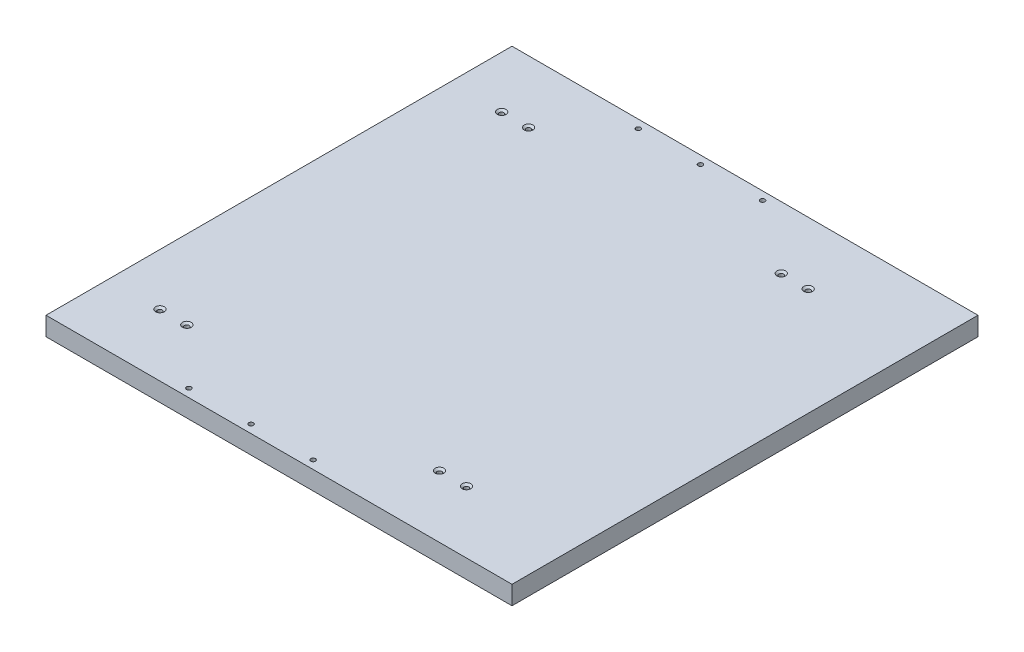
ISO-10303-21;
HEADER;
FILE_DESCRIPTION(('STEP AP214'),'2;1');
FILE_NAME('part.step','',(''),(''),'','','');
FILE_SCHEMA(('AUTOMOTIVE_DESIGN { 1 0 10303 214 1 1 1 1 }'));
ENDSEC;
DATA;
#1=APPLICATION_CONTEXT('core data for automotive mechanical design processes');
#2=APPLICATION_PROTOCOL_DEFINITION('international standard','automotive_design',2000,#1);
#3=PRODUCT_CONTEXT('',#1,'mechanical');
#4=PRODUCT('Part','Part','',(#3));
#5=PRODUCT_RELATED_PRODUCT_CATEGORY('part','',(#4));
#6=PRODUCT_DEFINITION_FORMATION('','',#4);
#7=PRODUCT_DEFINITION_CONTEXT('part definition',#1,'design');
#8=PRODUCT_DEFINITION('design','',#6,#7);
#9=PRODUCT_DEFINITION_SHAPE('','',#8);
#10=(LENGTH_UNIT() NAMED_UNIT(*) SI_UNIT(.MILLI.,.METRE.));
#11=(NAMED_UNIT(*) PLANE_ANGLE_UNIT() SI_UNIT($,.RADIAN.));
#12=(NAMED_UNIT(*) SI_UNIT($,.STERADIAN.) SOLID_ANGLE_UNIT());
#13=UNCERTAINTY_MEASURE_WITH_UNIT(LENGTH_MEASURE(1.E-05),#10,'distance_accuracy_value','');
#14=(GEOMETRIC_REPRESENTATION_CONTEXT(3) GLOBAL_UNCERTAINTY_ASSIGNED_CONTEXT((#13)) GLOBAL_UNIT_ASSIGNED_CONTEXT((#10,
#11,#12)) REPRESENTATION_CONTEXT('',''));
#15=CARTESIAN_POINT('',(0.,0.,0.));
#16=DIRECTION('',(0.,0.,1.));
#17=DIRECTION('',(1.,0.,0.));
#18=AXIS2_PLACEMENT_3D('',#15,#16,#17);
#19=CARTESIAN_POINT('',(0.,-9.,0.));
#20=DIRECTION('',(0.,-1.,0.));
#21=DIRECTION('',(0.,0.,-1.));
#22=AXIS2_PLACEMENT_3D('',#19,#20,#21);
#23=PLANE('',#22);
#24=CARTESIAN_POINT('',(-149.,-9.,165.));
#25=DIRECTION('',(0.,1.,0.));
#26=DIRECTION('',(0.,0.,1.));
#27=AXIS2_PLACEMENT_3D('',#24,#25,#26);
#28=CIRCLE('',#27,2.2479);
#29=CARTESIAN_POINT('',(-149.,-9.,167.2479));
#30=VERTEX_POINT('',#29);
#31=EDGE_CURVE('E331',#30,#30,#28,.T.);
#32=ORIENTED_EDGE('',*,*,#31,.T.);
#33=EDGE_LOOP('',(#32));
#34=FACE_BOUND('',#33,.T.);
#35=CARTESIAN_POINT('',(-35.0000000000001,-9.,-217.));
#36=DIRECTION('',(0.,-1.,0.));
#37=DIRECTION('',(0.,0.,-1.));
#38=AXIS2_PLACEMENT_3D('',#35,#36,#37);
#39=CIRCLE('',#38,4.2164);
#40=CARTESIAN_POINT('',(-35.0000000000001,-9.,-221.2164));
#41=VERTEX_POINT('',#40);
#42=EDGE_CURVE('E333',#41,#41,#39,.T.);
#43=ORIENTED_EDGE('',*,*,#42,.F.);
#44=EDGE_LOOP('',(#43));
#45=FACE_BOUND('',#44,.T.);
#46=CARTESIAN_POINT('',(-94.9999999999999,-9.,-217.));
#47=DIRECTION('',(0.,-1.,0.));
#48=DIRECTION('',(0.,0.,-1.));
#49=AXIS2_PLACEMENT_3D('',#46,#47,#48);
#50=CIRCLE('',#49,4.21639999999999);
#51=CARTESIAN_POINT('',(-94.9999999999999,-9.,-221.2164));
#52=VERTEX_POINT('',#51);
#53=EDGE_CURVE('E342',#52,#52,#50,.T.);
#54=ORIENTED_EDGE('',*,*,#53,.F.);
#55=EDGE_LOOP('',(#54));
#56=FACE_BOUND('',#55,.T.);
#57=CARTESIAN_POINT('',(24.9999999999999,-9.,-217.));
#58=DIRECTION('',(0.,-1.,0.));
#59=DIRECTION('',(0.,0.,-1.));
#60=AXIS2_PLACEMENT_3D('',#57,#58,#59);
#61=CIRCLE('',#60,4.2164);
#62=CARTESIAN_POINT('',(24.9999999999999,-9.,-221.2164));
#63=VERTEX_POINT('',#62);
#64=EDGE_CURVE('E351',#63,#63,#61,.T.);
#65=ORIENTED_EDGE('',*,*,#64,.F.);
#66=EDGE_LOOP('',(#65));
#67=FACE_BOUND('',#66,.T.);
#68=CARTESIAN_POINT('',(-35.0000000000001,-9.,217.));
#69=DIRECTION('',(0.,-1.,0.));
#70=DIRECTION('',(0.,0.,-1.));
#71=AXIS2_PLACEMENT_3D('',#68,#69,#70);
#72=CIRCLE('',#71,4.2164);
#73=CARTESIAN_POINT('',(-35.0000000000001,-9.,212.7836));
#74=VERTEX_POINT('',#73);
#75=EDGE_CURVE('E360',#74,#74,#72,.T.);
#76=ORIENTED_EDGE('',*,*,#75,.F.);
#77=EDGE_LOOP('',(#76));
#78=FACE_BOUND('',#77,.T.);
#79=CARTESIAN_POINT('',(-94.9999999999999,-9.,217.));
#80=DIRECTION('',(0.,-1.,0.));
#81=DIRECTION('',(0.,0.,-1.));
#82=AXIS2_PLACEMENT_3D('',#79,#80,#81);
#83=CIRCLE('',#82,4.21639999999999);
#84=CARTESIAN_POINT('',(-94.9999999999999,-9.,212.7836));
#85=VERTEX_POINT('',#84);
#86=EDGE_CURVE('E369',#85,#85,#83,.T.);
#87=ORIENTED_EDGE('',*,*,#86,.F.);
#88=EDGE_LOOP('',(#87));
#89=FACE_BOUND('',#88,.T.);
#90=CARTESIAN_POINT('',(24.9999999999999,-9.,217.));
#91=DIRECTION('',(0.,-1.,0.));
#92=DIRECTION('',(0.,0.,-1.));
#93=AXIS2_PLACEMENT_3D('',#90,#91,#92);
#94=CIRCLE('',#93,4.2164);
#95=CARTESIAN_POINT('',(24.9999999999999,-9.,212.7836));
#96=VERTEX_POINT('',#95);
#97=EDGE_CURVE('E378',#96,#96,#94,.T.);
#98=ORIENTED_EDGE('',*,*,#97,.F.);
#99=EDGE_LOOP('',(#98));
#100=FACE_BOUND('',#99,.T.);
#101=DIRECTION('',(1.,0.,0.));
#102=VECTOR('',#101,1.);
#103=CARTESIAN_POINT('',(-225.,-9.,-225.));
#104=LINE('',#103,#102);
#105=CARTESIAN_POINT('',(-225.,-9.,-225.));
#106=VERTEX_POINT('',#105);
#107=CARTESIAN_POINT('',(225.,-9.,-225.));
#108=VERTEX_POINT('',#107);
#109=EDGE_CURVE('E109',#106,#108,#104,.T.);
#110=ORIENTED_EDGE('',*,*,#109,.T.);
#111=DIRECTION('',(0.,0.,1.));
#112=VECTOR('',#111,1.);
#113=CARTESIAN_POINT('',(225.,-9.,-225.));
#114=LINE('',#113,#112);
#115=CARTESIAN_POINT('',(225.,-9.,225.));
#116=VERTEX_POINT('',#115);
#117=EDGE_CURVE('E112',#108,#116,#114,.T.);
#118=ORIENTED_EDGE('',*,*,#117,.T.);
#119=DIRECTION('',(1.,0.,0.));
#120=VECTOR('',#119,1.);
#121=CARTESIAN_POINT('',(-225.,-9.,225.));
#122=LINE('',#121,#120);
#123=CARTESIAN_POINT('',(-225.,-9.,225.));
#124=VERTEX_POINT('',#123);
#125=EDGE_CURVE('E100',#124,#116,#122,.T.);
#126=ORIENTED_EDGE('',*,*,#125,.F.);
#127=DIRECTION('',(0.,0.,1.));
#128=VECTOR('',#127,1.);
#129=CARTESIAN_POINT('',(-225.,-9.,-225.));
#130=LINE('',#129,#128);
#131=EDGE_CURVE('E75',#106,#124,#130,.T.);
#132=ORIENTED_EDGE('',*,*,#131,.F.);
#133=EDGE_LOOP('',(#110,#118,#126,#132));
#134=FACE_BOUND('',#133,.T.);
#135=CARTESIAN_POINT('',(-175.,-9.,165.));
#136=DIRECTION('',(0.,1.,0.));
#137=DIRECTION('',(0.,0.,1.));
#138=AXIS2_PLACEMENT_3D('',#135,#136,#137);
#139=CIRCLE('',#138,2.2479);
#140=CARTESIAN_POINT('',(-175.,-9.,167.2479));
#141=VERTEX_POINT('',#140);
#142=EDGE_CURVE('E322',#141,#141,#139,.T.);
#143=ORIENTED_EDGE('',*,*,#142,.T.);
#144=EDGE_LOOP('',(#143));
#145=FACE_BOUND('',#144,.T.);
#146=CARTESIAN_POINT('',(95.,-9.,165.));
#147=DIRECTION('',(0.,1.,0.));
#148=DIRECTION('',(0.,0.,1.));
#149=AXIS2_PLACEMENT_3D('',#146,#147,#148);
#150=CIRCLE('',#149,2.2479);
#151=CARTESIAN_POINT('',(95.,-9.,167.2479));
#152=VERTEX_POINT('',#151);
#153=EDGE_CURVE('E310',#152,#152,#150,.T.);
#154=ORIENTED_EDGE('',*,*,#153,.T.);
#155=EDGE_LOOP('',(#154));
#156=FACE_BOUND('',#155,.T.);
#157=CARTESIAN_POINT('',(121.,-9.,165.));
#158=DIRECTION('',(0.,1.,0.));
#159=DIRECTION('',(0.,0.,1.));
#160=AXIS2_PLACEMENT_3D('',#157,#158,#159);
#161=CIRCLE('',#160,2.2479);
#162=CARTESIAN_POINT('',(121.,-9.,167.2479));
#163=VERTEX_POINT('',#162);
#164=EDGE_CURVE('E301',#163,#163,#161,.T.);
#165=ORIENTED_EDGE('',*,*,#164,.T.);
#166=EDGE_LOOP('',(#165));
#167=FACE_BOUND('',#166,.T.);
#168=CARTESIAN_POINT('',(-149.,-9.,-165.));
#169=DIRECTION('',(0.,1.,0.));
#170=DIRECTION('',(0.,0.,1.));
#171=AXIS2_PLACEMENT_3D('',#168,#169,#170);
#172=CIRCLE('',#171,2.2479);
#173=CARTESIAN_POINT('',(-149.,-9.,-162.7521));
#174=VERTEX_POINT('',#173);
#175=EDGE_CURVE('E295',#174,#174,#172,.T.);
#176=ORIENTED_EDGE('',*,*,#175,.T.);
#177=EDGE_LOOP('',(#176));
#178=FACE_BOUND('',#177,.T.);
#179=CARTESIAN_POINT('',(-175.,-9.,-165.));
#180=DIRECTION('',(0.,1.,0.));
#181=DIRECTION('',(0.,0.,1.));
#182=AXIS2_PLACEMENT_3D('',#179,#180,#181);
#183=CIRCLE('',#182,2.2479);
#184=CARTESIAN_POINT('',(-175.,-9.,-162.7521));
#185=VERTEX_POINT('',#184);
#186=EDGE_CURVE('E286',#185,#185,#183,.T.);
#187=ORIENTED_EDGE('',*,*,#186,.T.);
#188=EDGE_LOOP('',(#187));
#189=FACE_BOUND('',#188,.T.);
#190=CARTESIAN_POINT('',(121.,-9.,-165.));
#191=DIRECTION('',(0.,1.,0.));
#192=DIRECTION('',(0.,0.,1.));
#193=AXIS2_PLACEMENT_3D('',#190,#191,#192);
#194=CIRCLE('',#193,2.2479);
#195=CARTESIAN_POINT('',(121.,-9.,-162.7521));
#196=VERTEX_POINT('',#195);
#197=EDGE_CURVE('E277',#196,#196,#194,.T.);
#198=ORIENTED_EDGE('',*,*,#197,.T.);
#199=EDGE_LOOP('',(#198));
#200=FACE_BOUND('',#199,.T.);
#201=CARTESIAN_POINT('',(95.,-9.,-165.));
#202=DIRECTION('',(0.,1.,0.));
#203=DIRECTION('',(0.,0.,1.));
#204=AXIS2_PLACEMENT_3D('',#201,#202,#203);
#205=CIRCLE('',#204,2.2479);
#206=CARTESIAN_POINT('',(95.,-9.,-162.7521));
#207=VERTEX_POINT('',#206);
#208=EDGE_CURVE('E266',#207,#207,#205,.T.);
#209=ORIENTED_EDGE('',*,*,#208,.T.);
#210=EDGE_LOOP('',(#209));
#211=FACE_BOUND('',#210,.T.);
#212=ADVANCED_FACE('F41',(#34,#45,#56,#67,#78,#89,#100,#134,#145,#156,#167,#178,#189,#200,#211),
#23,.T.);
#213=CARTESIAN_POINT('',(0.,9.,0.));
#214=DIRECTION('',(0.,-1.,0.));
#215=DIRECTION('',(0.,0.,-1.));
#216=AXIS2_PLACEMENT_3D('',#213,#214,#215);
#217=PLANE('',#216);
#218=CARTESIAN_POINT('',(95.,9.,-165.));
#219=DIRECTION('',(0.,1.,0.));
#220=DIRECTION('',(0.,0.,1.));
#221=AXIS2_PLACEMENT_3D('',#218,#219,#220);
#222=CIRCLE('',#221,4.21639999999999);
#223=CARTESIAN_POINT('',(95.,9.,-160.7836));
#224=VERTEX_POINT('',#223);
#225=EDGE_CURVE('E264',#224,#224,#222,.T.);
#226=ORIENTED_EDGE('',*,*,#225,.F.);
#227=EDGE_LOOP('',(#226));
#228=FACE_BOUND('',#227,.T.);
#229=CARTESIAN_POINT('',(-175.,9.,-165.));
#230=DIRECTION('',(0.,1.,0.));
#231=DIRECTION('',(0.,0.,1.));
#232=AXIS2_PLACEMENT_3D('',#229,#230,#231);
#233=CIRCLE('',#232,4.21640000000001);
#234=CARTESIAN_POINT('',(-175.,9.,-160.7836));
#235=VERTEX_POINT('',#234);
#236=EDGE_CURVE('E280',#235,#235,#233,.T.);
#237=ORIENTED_EDGE('',*,*,#236,.F.);
#238=EDGE_LOOP('',(#237));
#239=FACE_BOUND('',#238,.T.);
#240=CARTESIAN_POINT('',(-149.,9.,-165.));
#241=DIRECTION('',(0.,1.,0.));
#242=DIRECTION('',(0.,0.,1.));
#243=AXIS2_PLACEMENT_3D('',#240,#241,#242);
#244=CIRCLE('',#243,4.21640000000001);
#245=CARTESIAN_POINT('',(-149.,9.,-160.7836));
#246=VERTEX_POINT('',#245);
#247=EDGE_CURVE('E289',#246,#246,#244,.T.);
#248=ORIENTED_EDGE('',*,*,#247,.F.);
#249=EDGE_LOOP('',(#248));
#250=FACE_BOUND('',#249,.T.);
#251=CARTESIAN_POINT('',(121.,9.,165.));
#252=DIRECTION('',(0.,1.,0.));
#253=DIRECTION('',(0.,0.,1.));
#254=AXIS2_PLACEMENT_3D('',#251,#252,#253);
#255=CIRCLE('',#254,4.21640000000001);
#256=CARTESIAN_POINT('',(121.,9.,169.2164));
#257=VERTEX_POINT('',#256);
#258=EDGE_CURVE('E298',#257,#257,#255,.T.);
#259=ORIENTED_EDGE('',*,*,#258,.F.);
#260=EDGE_LOOP('',(#259));
#261=FACE_BOUND('',#260,.T.);
#262=CARTESIAN_POINT('',(95.,9.,165.));
#263=DIRECTION('',(0.,1.,0.));
#264=DIRECTION('',(0.,0.,1.));
#265=AXIS2_PLACEMENT_3D('',#262,#263,#264);
#266=CIRCLE('',#265,4.21640000000001);
#267=CARTESIAN_POINT('',(95.,9.,169.2164));
#268=VERTEX_POINT('',#267);
#269=EDGE_CURVE('E307',#268,#268,#266,.T.);
#270=ORIENTED_EDGE('',*,*,#269,.F.);
#271=EDGE_LOOP('',(#270));
#272=FACE_BOUND('',#271,.T.);
#273=CARTESIAN_POINT('',(-175.,9.,165.));
#274=DIRECTION('',(0.,1.,0.));
#275=DIRECTION('',(0.,0.,1.));
#276=AXIS2_PLACEMENT_3D('',#273,#274,#275);
#277=CIRCLE('',#276,4.21640000000001);
#278=CARTESIAN_POINT('',(-175.,9.,169.2164));
#279=VERTEX_POINT('',#278);
#280=EDGE_CURVE('E316',#279,#279,#277,.T.);
#281=ORIENTED_EDGE('',*,*,#280,.F.);
#282=EDGE_LOOP('',(#281));
#283=FACE_BOUND('',#282,.T.);
#284=CARTESIAN_POINT('',(-149.,9.,165.));
#285=DIRECTION('',(0.,1.,0.));
#286=DIRECTION('',(0.,0.,1.));
#287=AXIS2_PLACEMENT_3D('',#284,#285,#286);
#288=CIRCLE('',#287,4.21640000000001);
#289=CARTESIAN_POINT('',(-149.,9.,169.2164));
#290=VERTEX_POINT('',#289);
#291=EDGE_CURVE('E325',#290,#290,#288,.T.);
#292=ORIENTED_EDGE('',*,*,#291,.F.);
#293=EDGE_LOOP('',(#292));
#294=FACE_BOUND('',#293,.T.);
#295=CARTESIAN_POINT('',(-35.0000000000001,9.,-217.));
#296=DIRECTION('',(0.,-1.,0.));
#297=DIRECTION('',(0.,0.,-1.));
#298=AXIS2_PLACEMENT_3D('',#295,#296,#297);
#299=CIRCLE('',#298,2.2479);
#300=CARTESIAN_POINT('',(-35.0000000000001,9.,-219.2479));
#301=VERTEX_POINT('',#300);
#302=EDGE_CURVE('E339',#301,#301,#299,.T.);
#303=ORIENTED_EDGE('',*,*,#302,.T.);
#304=EDGE_LOOP('',(#303));
#305=FACE_BOUND('',#304,.T.);
#306=CARTESIAN_POINT('',(-94.9999999999999,9.,-217.));
#307=DIRECTION('',(0.,-1.,0.));
#308=DIRECTION('',(0.,0.,-1.));
#309=AXIS2_PLACEMENT_3D('',#306,#307,#308);
#310=CIRCLE('',#309,2.2479);
#311=CARTESIAN_POINT('',(-94.9999999999999,9.,-219.2479));
#312=VERTEX_POINT('',#311);
#313=EDGE_CURVE('E348',#312,#312,#310,.T.);
#314=ORIENTED_EDGE('',*,*,#313,.T.);
#315=EDGE_LOOP('',(#314));
#316=FACE_BOUND('',#315,.T.);
#317=CARTESIAN_POINT('',(24.9999999999999,9.,-217.));
#318=DIRECTION('',(0.,-1.,0.));
#319=DIRECTION('',(0.,0.,-1.));
#320=AXIS2_PLACEMENT_3D('',#317,#318,#319);
#321=CIRCLE('',#320,2.24789999999999);
#322=CARTESIAN_POINT('',(24.9999999999999,9.,-219.2479));
#323=VERTEX_POINT('',#322);
#324=EDGE_CURVE('E357',#323,#323,#321,.T.);
#325=ORIENTED_EDGE('',*,*,#324,.T.);
#326=EDGE_LOOP('',(#325));
#327=FACE_BOUND('',#326,.T.);
#328=CARTESIAN_POINT('',(-35.0000000000001,9.,217.));
#329=DIRECTION('',(0.,-1.,0.));
#330=DIRECTION('',(0.,0.,-1.));
#331=AXIS2_PLACEMENT_3D('',#328,#329,#330);
#332=CIRCLE('',#331,2.2479);
#333=CARTESIAN_POINT('',(-35.0000000000001,9.,214.7521));
#334=VERTEX_POINT('',#333);
#335=EDGE_CURVE('E366',#334,#334,#332,.T.);
#336=ORIENTED_EDGE('',*,*,#335,.T.);
#337=EDGE_LOOP('',(#336));
#338=FACE_BOUND('',#337,.T.);
#339=CARTESIAN_POINT('',(-94.9999999999999,9.,217.));
#340=DIRECTION('',(0.,-1.,0.));
#341=DIRECTION('',(0.,0.,-1.));
#342=AXIS2_PLACEMENT_3D('',#339,#340,#341);
#343=CIRCLE('',#342,2.2479);
#344=CARTESIAN_POINT('',(-94.9999999999999,9.,214.7521));
#345=VERTEX_POINT('',#344);
#346=EDGE_CURVE('E375',#345,#345,#343,.T.);
#347=ORIENTED_EDGE('',*,*,#346,.T.);
#348=EDGE_LOOP('',(#347));
#349=FACE_BOUND('',#348,.T.);
#350=CARTESIAN_POINT('',(24.9999999999999,9.,217.));
#351=DIRECTION('',(0.,-1.,0.));
#352=DIRECTION('',(0.,0.,-1.));
#353=AXIS2_PLACEMENT_3D('',#350,#351,#352);
#354=CIRCLE('',#353,2.24789999999999);
#355=CARTESIAN_POINT('',(24.9999999999999,9.,214.7521));
#356=VERTEX_POINT('',#355);
#357=EDGE_CURVE('E113',#356,#356,#354,.T.);
#358=ORIENTED_EDGE('',*,*,#357,.T.);
#359=EDGE_LOOP('',(#358));
#360=FACE_BOUND('',#359,.T.);
#361=DIRECTION('',(1.,0.,0.));
#362=VECTOR('',#361,1.);
#363=CARTESIAN_POINT('',(-225.,9.,-225.));
#364=LINE('',#363,#362);
#365=CARTESIAN_POINT('',(-225.,9.,-225.));
#366=VERTEX_POINT('',#365);
#367=CARTESIAN_POINT('',(225.,9.,-225.));
#368=VERTEX_POINT('',#367);
#369=EDGE_CURVE('E103',#366,#368,#364,.T.);
#370=ORIENTED_EDGE('',*,*,#369,.F.);
#371=DIRECTION('',(0.,0.,1.));
#372=VECTOR('',#371,1.);
#373=CARTESIAN_POINT('',(-225.,9.,-225.));
#374=LINE('',#373,#372);
#375=CARTESIAN_POINT('',(-225.,9.,225.));
#376=VERTEX_POINT('',#375);
#377=EDGE_CURVE('E93',#366,#376,#374,.T.);
#378=ORIENTED_EDGE('',*,*,#377,.T.);
#379=DIRECTION('',(1.,0.,0.));
#380=VECTOR('',#379,1.);
#381=CARTESIAN_POINT('',(-225.,9.,225.));
#382=LINE('',#381,#380);
#383=CARTESIAN_POINT('',(225.,9.,225.));
#384=VERTEX_POINT('',#383);
#385=EDGE_CURVE('E87',#376,#384,#382,.T.);
#386=ORIENTED_EDGE('',*,*,#385,.T.);
#387=DIRECTION('',(0.,0.,1.));
#388=VECTOR('',#387,1.);
#389=CARTESIAN_POINT('',(225.,9.,-225.));
#390=LINE('',#389,#388);
#391=EDGE_CURVE('E92',#368,#384,#390,.T.);
#392=ORIENTED_EDGE('',*,*,#391,.F.);
#393=EDGE_LOOP('',(#370,#378,#386,#392));
#394=FACE_BOUND('',#393,.T.);
#395=CARTESIAN_POINT('',(121.,9.,-165.));
#396=DIRECTION('',(0.,1.,0.));
#397=DIRECTION('',(0.,0.,1.));
#398=AXIS2_PLACEMENT_3D('',#395,#396,#397);
#399=CIRCLE('',#398,4.21640000000001);
#400=CARTESIAN_POINT('',(121.,9.,-160.7836));
#401=VERTEX_POINT('',#400);
#402=EDGE_CURVE('E271',#401,#401,#399,.T.);
#403=ORIENTED_EDGE('',*,*,#402,.F.);
#404=EDGE_LOOP('',(#403));
#405=FACE_BOUND('',#404,.T.);
#406=ADVANCED_FACE('F90',(#228,#239,#250,#261,#272,#283,#294,#305,#316,#327,#338,#349,#360,#394,
#405),#217,.F.);
#407=CARTESIAN_POINT('',(-225.,9.,-225.));
#408=DIRECTION('',(0.,0.,-1.));
#409=DIRECTION('',(-1.,0.,0.));
#410=AXIS2_PLACEMENT_3D('',#407,#408,#409);
#411=PLANE('',#410);
#412=ORIENTED_EDGE('',*,*,#109,.F.);
#413=DIRECTION('',(0.,-1.,0.));
#414=VECTOR('',#413,1.);
#415=CARTESIAN_POINT('',(-225.,9.,-225.));
#416=LINE('',#415,#414);
#417=EDGE_CURVE('E11',#366,#106,#416,.T.);
#418=ORIENTED_EDGE('',*,*,#417,.F.);
#419=ORIENTED_EDGE('',*,*,#369,.T.);
#420=DIRECTION('',(0.,-1.,0.));
#421=VECTOR('',#420,1.);
#422=CARTESIAN_POINT('',(225.,9.,-225.));
#423=LINE('',#422,#421);
#424=EDGE_CURVE('E45',#368,#108,#423,.T.);
#425=ORIENTED_EDGE('',*,*,#424,.T.);
#426=EDGE_LOOP('',(#412,#418,#419,#425));
#427=FACE_BOUND('',#426,.T.);
#428=ADVANCED_FACE('F43',(#427),#411,.T.);
#429=CARTESIAN_POINT('',(-225.,9.,-225.));
#430=DIRECTION('',(1.,0.,0.));
#431=DIRECTION('',(0.,0.,-1.));
#432=AXIS2_PLACEMENT_3D('',#429,#430,#431);
#433=PLANE('',#432);
#434=ORIENTED_EDGE('',*,*,#131,.T.);
#435=DIRECTION('',(0.,-1.,0.));
#436=VECTOR('',#435,1.);
#437=CARTESIAN_POINT('',(-225.,9.,225.));
#438=LINE('',#437,#436);
#439=EDGE_CURVE('E51',#376,#124,#438,.T.);
#440=ORIENTED_EDGE('',*,*,#439,.F.);
#441=ORIENTED_EDGE('',*,*,#377,.F.);
#442=ORIENTED_EDGE('',*,*,#417,.T.);
#443=EDGE_LOOP('',(#434,#440,#441,#442));
#444=FACE_BOUND('',#443,.T.);
#445=ADVANCED_FACE('F120',(#444),#433,.F.);
#446=CARTESIAN_POINT('',(-225.,9.,225.));
#447=DIRECTION('',(0.,0.,-1.));
#448=DIRECTION('',(-1.,0.,0.));
#449=AXIS2_PLACEMENT_3D('',#446,#447,#448);
#450=PLANE('',#449);
#451=ORIENTED_EDGE('',*,*,#125,.T.);
#452=DIRECTION('',(0.,-1.,0.));
#453=VECTOR('',#452,1.);
#454=CARTESIAN_POINT('',(225.,9.,225.));
#455=LINE('',#454,#453);
#456=EDGE_CURVE('E97',#384,#116,#455,.T.);
#457=ORIENTED_EDGE('',*,*,#456,.F.);
#458=ORIENTED_EDGE('',*,*,#385,.F.);
#459=ORIENTED_EDGE('',*,*,#439,.T.);
#460=EDGE_LOOP('',(#451,#457,#458,#459));
#461=FACE_BOUND('',#460,.T.);
#462=ADVANCED_FACE('F98',(#461),#450,.F.);
#463=CARTESIAN_POINT('',(225.,9.,-225.));
#464=DIRECTION('',(1.,0.,0.));
#465=DIRECTION('',(0.,0.,-1.));
#466=AXIS2_PLACEMENT_3D('',#463,#464,#465);
#467=PLANE('',#466);
#468=ORIENTED_EDGE('',*,*,#117,.F.);
#469=ORIENTED_EDGE('',*,*,#424,.F.);
#470=ORIENTED_EDGE('',*,*,#391,.T.);
#471=ORIENTED_EDGE('',*,*,#456,.T.);
#472=EDGE_LOOP('',(#468,#469,#470,#471));
#473=FACE_BOUND('',#472,.T.);
#474=ADVANCED_FACE('F102',(#473),#467,.T.);
#475=CARTESIAN_POINT('',(24.9999999999999,-9.,217.));
#476=DIRECTION('',(0.,-1.,0.));
#477=DIRECTION('',(0.,0.,-1.));
#478=AXIS2_PLACEMENT_3D('',#475,#476,#477);
#479=CYLINDRICAL_SURFACE('',#478,2.24789999999999);
#480=ORIENTED_EDGE('',*,*,#357,.F.);
#481=EDGE_LOOP('',(#480));
#482=FACE_BOUND('',#481,.T.);
#483=CARTESIAN_POINT('',(24.9999999999999,-7.34823237602753,217.));
#484=DIRECTION('',(0.,-1.,0.));
#485=DIRECTION('',(0.,0.,-1.));
#486=AXIS2_PLACEMENT_3D('',#483,#484,#485);
#487=CIRCLE('',#486,2.24789999999999);
#488=CARTESIAN_POINT('',(24.9999999999999,-7.34823237602753,214.7521));
#489=VERTEX_POINT('',#488);
#490=EDGE_CURVE('E381',#489,#489,#487,.T.);
#491=ORIENTED_EDGE('',*,*,#490,.T.);
#492=EDGE_LOOP('',(#491));
#493=FACE_BOUND('',#492,.T.);
#494=ADVANCED_FACE('F140',(#482,#493),#479,.F.);
#495=CARTESIAN_POINT('',(24.9999999999999,-9.,217.));
#496=DIRECTION('',(0.,-1.,0.));
#497=DIRECTION('',(0.,0.,-1.));
#498=AXIS2_PLACEMENT_3D('',#495,#496,#497);
#499=CONICAL_SURFACE('',#498,4.2164,0.87266462599717);
#500=ORIENTED_EDGE('',*,*,#490,.F.);
#501=EDGE_LOOP('',(#500));
#502=FACE_BOUND('',#501,.T.);
#503=ORIENTED_EDGE('',*,*,#97,.T.);
#504=EDGE_LOOP('',(#503));
#505=FACE_BOUND('',#504,.T.);
#506=ADVANCED_FACE('F144',(#502,#505),#499,.F.);
#507=CARTESIAN_POINT('',(-94.9999999999999,-9.,217.));
#508=DIRECTION('',(0.,-1.,0.));
#509=DIRECTION('',(0.,0.,-1.));
#510=AXIS2_PLACEMENT_3D('',#507,#508,#509);
#511=CYLINDRICAL_SURFACE('',#510,2.24789999999999);
#512=ORIENTED_EDGE('',*,*,#346,.F.);
#513=EDGE_LOOP('',(#512));
#514=FACE_BOUND('',#513,.T.);
#515=CARTESIAN_POINT('',(-94.9999999999999,-7.34823237602753,217.));
#516=DIRECTION('',(0.,-1.,0.));
#517=DIRECTION('',(0.,0.,-1.));
#518=AXIS2_PLACEMENT_3D('',#515,#516,#517);
#519=CIRCLE('',#518,2.24789999999998);
#520=CARTESIAN_POINT('',(-94.9999999999999,-7.34823237602753,214.7521));
#521=VERTEX_POINT('',#520);
#522=EDGE_CURVE('E372',#521,#521,#519,.T.);
#523=ORIENTED_EDGE('',*,*,#522,.T.);
#524=EDGE_LOOP('',(#523));
#525=FACE_BOUND('',#524,.T.);
#526=ADVANCED_FACE('F149',(#514,#525),#511,.F.);
#527=CARTESIAN_POINT('',(-94.9999999999999,-9.,217.));
#528=DIRECTION('',(0.,-1.,0.));
#529=DIRECTION('',(0.,0.,-1.));
#530=AXIS2_PLACEMENT_3D('',#527,#528,#529);
#531=CONICAL_SURFACE('',#530,4.21639999999999,0.872664625997169);
#532=ORIENTED_EDGE('',*,*,#522,.F.);
#533=EDGE_LOOP('',(#532));
#534=FACE_BOUND('',#533,.T.);
#535=ORIENTED_EDGE('',*,*,#86,.T.);
#536=EDGE_LOOP('',(#535));
#537=FACE_BOUND('',#536,.T.);
#538=ADVANCED_FACE('F157',(#534,#537),#531,.F.);
#539=CARTESIAN_POINT('',(-35.0000000000001,-9.,217.));
#540=DIRECTION('',(0.,-1.,0.));
#541=DIRECTION('',(0.,0.,-1.));
#542=AXIS2_PLACEMENT_3D('',#539,#540,#541);
#543=CYLINDRICAL_SURFACE('',#542,2.24789999999999);
#544=ORIENTED_EDGE('',*,*,#335,.F.);
#545=EDGE_LOOP('',(#544));
#546=FACE_BOUND('',#545,.T.);
#547=CARTESIAN_POINT('',(-35.0000000000001,-7.34823237602753,217.));
#548=DIRECTION('',(0.,-1.,0.));
#549=DIRECTION('',(0.,0.,-1.));
#550=AXIS2_PLACEMENT_3D('',#547,#548,#549);
#551=CIRCLE('',#550,2.24789999999998);
#552=CARTESIAN_POINT('',(-35.0000000000001,-7.34823237602753,214.7521));
#553=VERTEX_POINT('',#552);
#554=EDGE_CURVE('E363',#553,#553,#551,.T.);
#555=ORIENTED_EDGE('',*,*,#554,.T.);
#556=EDGE_LOOP('',(#555));
#557=FACE_BOUND('',#556,.T.);
#558=ADVANCED_FACE('F161',(#546,#557),#543,.F.);
#559=CARTESIAN_POINT('',(-35.0000000000001,-9.,217.));
#560=DIRECTION('',(0.,-1.,0.));
#561=DIRECTION('',(0.,0.,-1.));
#562=AXIS2_PLACEMENT_3D('',#559,#560,#561);
#563=CONICAL_SURFACE('',#562,4.2164,0.872664625997171);
#564=ORIENTED_EDGE('',*,*,#554,.F.);
#565=EDGE_LOOP('',(#564));
#566=FACE_BOUND('',#565,.T.);
#567=ORIENTED_EDGE('',*,*,#75,.T.);
#568=EDGE_LOOP('',(#567));
#569=FACE_BOUND('',#568,.T.);
#570=ADVANCED_FACE('F165',(#566,#569),#563,.F.);
#571=CARTESIAN_POINT('',(24.9999999999999,-9.,-217.));
#572=DIRECTION('',(0.,-1.,0.));
#573=DIRECTION('',(0.,0.,-1.));
#574=AXIS2_PLACEMENT_3D('',#571,#572,#573);
#575=CYLINDRICAL_SURFACE('',#574,2.24789999999999);
#576=ORIENTED_EDGE('',*,*,#324,.F.);
#577=EDGE_LOOP('',(#576));
#578=FACE_BOUND('',#577,.T.);
#579=CARTESIAN_POINT('',(24.9999999999999,-7.34823237602753,-217.));
#580=DIRECTION('',(0.,-1.,0.));
#581=DIRECTION('',(0.,0.,-1.));
#582=AXIS2_PLACEMENT_3D('',#579,#580,#581);
#583=CIRCLE('',#582,2.24789999999999);
#584=CARTESIAN_POINT('',(24.9999999999999,-7.34823237602753,-219.2479));
#585=VERTEX_POINT('',#584);
#586=EDGE_CURVE('E354',#585,#585,#583,.T.);
#587=ORIENTED_EDGE('',*,*,#586,.T.);
#588=EDGE_LOOP('',(#587));
#589=FACE_BOUND('',#588,.T.);
#590=ADVANCED_FACE('F169',(#578,#589),#575,.F.);
#591=CARTESIAN_POINT('',(24.9999999999999,-9.,-217.));
#592=DIRECTION('',(0.,-1.,0.));
#593=DIRECTION('',(0.,0.,-1.));
#594=AXIS2_PLACEMENT_3D('',#591,#592,#593);
#595=CONICAL_SURFACE('',#594,4.2164,0.87266462599717);
#596=ORIENTED_EDGE('',*,*,#586,.F.);
#597=EDGE_LOOP('',(#596));
#598=FACE_BOUND('',#597,.T.);
#599=ORIENTED_EDGE('',*,*,#64,.T.);
#600=EDGE_LOOP('',(#599));
#601=FACE_BOUND('',#600,.T.);
#602=ADVANCED_FACE('F173',(#598,#601),#595,.F.);
#603=CARTESIAN_POINT('',(-94.9999999999999,-9.,-217.));
#604=DIRECTION('',(0.,-1.,0.));
#605=DIRECTION('',(0.,0.,-1.));
#606=AXIS2_PLACEMENT_3D('',#603,#604,#605);
#607=CYLINDRICAL_SURFACE('',#606,2.24789999999999);
#608=ORIENTED_EDGE('',*,*,#313,.F.);
#609=EDGE_LOOP('',(#608));
#610=FACE_BOUND('',#609,.T.);
#611=CARTESIAN_POINT('',(-94.9999999999999,-7.34823237602753,-217.));
#612=DIRECTION('',(0.,-1.,0.));
#613=DIRECTION('',(0.,0.,-1.));
#614=AXIS2_PLACEMENT_3D('',#611,#612,#613);
#615=CIRCLE('',#614,2.24789999999998);
#616=CARTESIAN_POINT('',(-94.9999999999999,-7.34823237602753,-219.2479));
#617=VERTEX_POINT('',#616);
#618=EDGE_CURVE('E345',#617,#617,#615,.T.);
#619=ORIENTED_EDGE('',*,*,#618,.T.);
#620=EDGE_LOOP('',(#619));
#621=FACE_BOUND('',#620,.T.);
#622=ADVANCED_FACE('F177',(#610,#621),#607,.F.);
#623=CARTESIAN_POINT('',(-94.9999999999999,-9.,-217.));
#624=DIRECTION('',(0.,-1.,0.));
#625=DIRECTION('',(0.,0.,-1.));
#626=AXIS2_PLACEMENT_3D('',#623,#624,#625);
#627=CONICAL_SURFACE('',#626,4.21639999999999,0.872664625997169);
#628=ORIENTED_EDGE('',*,*,#618,.F.);
#629=EDGE_LOOP('',(#628));
#630=FACE_BOUND('',#629,.T.);
#631=ORIENTED_EDGE('',*,*,#53,.T.);
#632=EDGE_LOOP('',(#631));
#633=FACE_BOUND('',#632,.T.);
#634=ADVANCED_FACE('F181',(#630,#633),#627,.F.);
#635=CARTESIAN_POINT('',(-35.0000000000001,-9.,-217.));
#636=DIRECTION('',(0.,-1.,0.));
#637=DIRECTION('',(0.,0.,-1.));
#638=AXIS2_PLACEMENT_3D('',#635,#636,#637);
#639=CYLINDRICAL_SURFACE('',#638,2.24789999999999);
#640=ORIENTED_EDGE('',*,*,#302,.F.);
#641=EDGE_LOOP('',(#640));
#642=FACE_BOUND('',#641,.T.);
#643=CARTESIAN_POINT('',(-35.0000000000001,-7.34823237602753,-217.));
#644=DIRECTION('',(0.,-1.,0.));
#645=DIRECTION('',(0.,0.,-1.));
#646=AXIS2_PLACEMENT_3D('',#643,#644,#645);
#647=CIRCLE('',#646,2.24789999999998);
#648=CARTESIAN_POINT('',(-35.0000000000001,-7.34823237602753,-219.2479));
#649=VERTEX_POINT('',#648);
#650=EDGE_CURVE('E336',#649,#649,#647,.T.);
#651=ORIENTED_EDGE('',*,*,#650,.T.);
#652=EDGE_LOOP('',(#651));
#653=FACE_BOUND('',#652,.T.);
#654=ADVANCED_FACE('F185',(#642,#653),#639,.F.);
#655=CARTESIAN_POINT('',(-35.0000000000001,-9.,-217.));
#656=DIRECTION('',(0.,-1.,0.));
#657=DIRECTION('',(0.,0.,-1.));
#658=AXIS2_PLACEMENT_3D('',#655,#656,#657);
#659=CONICAL_SURFACE('',#658,4.2164,0.872664625997171);
#660=ORIENTED_EDGE('',*,*,#650,.F.);
#661=EDGE_LOOP('',(#660));
#662=FACE_BOUND('',#661,.T.);
#663=ORIENTED_EDGE('',*,*,#42,.T.);
#664=EDGE_LOOP('',(#663));
#665=FACE_BOUND('',#664,.T.);
#666=ADVANCED_FACE('F189',(#662,#665),#659,.F.);
#667=CARTESIAN_POINT('',(-149.,9.,165.));
#668=DIRECTION('',(0.,1.,0.));
#669=DIRECTION('',(0.,0.,1.));
#670=AXIS2_PLACEMENT_3D('',#667,#668,#669);
#671=CYLINDRICAL_SURFACE('',#670,2.2479);
#672=ORIENTED_EDGE('',*,*,#31,.F.);
#673=EDGE_LOOP('',(#672));
#674=FACE_BOUND('',#673,.T.);
#675=CARTESIAN_POINT('',(-149.,7.34823237602752,165.));
#676=DIRECTION('',(0.,1.,0.));
#677=DIRECTION('',(0.,0.,1.));
#678=AXIS2_PLACEMENT_3D('',#675,#676,#677);
#679=CIRCLE('',#678,2.2479);
#680=CARTESIAN_POINT('',(-149.,7.34823237602752,167.2479));
#681=VERTEX_POINT('',#680);
#682=EDGE_CURVE('E328',#681,#681,#679,.T.);
#683=ORIENTED_EDGE('',*,*,#682,.T.);
#684=EDGE_LOOP('',(#683));
#685=FACE_BOUND('',#684,.T.);
#686=ADVANCED_FACE('F193',(#674,#685),#671,.F.);
#687=CARTESIAN_POINT('',(-149.,9.,165.));
#688=DIRECTION('',(0.,1.,0.));
#689=DIRECTION('',(0.,0.,1.));
#690=AXIS2_PLACEMENT_3D('',#687,#688,#689);
#691=CONICAL_SURFACE('',#690,4.21640000000001,0.872664625997166);
#692=ORIENTED_EDGE('',*,*,#682,.F.);
#693=EDGE_LOOP('',(#692));
#694=FACE_BOUND('',#693,.T.);
#695=ORIENTED_EDGE('',*,*,#291,.T.);
#696=EDGE_LOOP('',(#695));
#697=FACE_BOUND('',#696,.T.);
#698=ADVANCED_FACE('F197',(#694,#697),#691,.F.);
#699=CARTESIAN_POINT('',(-175.,9.,165.));
#700=DIRECTION('',(0.,1.,0.));
#701=DIRECTION('',(0.,0.,1.));
#702=AXIS2_PLACEMENT_3D('',#699,#700,#701);
#703=CYLINDRICAL_SURFACE('',#702,2.2479);
#704=ORIENTED_EDGE('',*,*,#142,.F.);
#705=EDGE_LOOP('',(#704));
#706=FACE_BOUND('',#705,.T.);
#707=CARTESIAN_POINT('',(-175.,7.34823237602752,165.));
#708=DIRECTION('',(0.,1.,0.));
#709=DIRECTION('',(0.,0.,1.));
#710=AXIS2_PLACEMENT_3D('',#707,#708,#709);
#711=CIRCLE('',#710,2.2479);
#712=CARTESIAN_POINT('',(-175.,7.34823237602752,167.2479));
#713=VERTEX_POINT('',#712);
#714=EDGE_CURVE('E319',#713,#713,#711,.T.);
#715=ORIENTED_EDGE('',*,*,#714,.T.);
#716=EDGE_LOOP('',(#715));
#717=FACE_BOUND('',#716,.T.);
#718=ADVANCED_FACE('F201',(#706,#717),#703,.F.);
#719=CARTESIAN_POINT('',(-175.,9.,165.));
#720=DIRECTION('',(0.,1.,0.));
#721=DIRECTION('',(0.,0.,1.));
#722=AXIS2_PLACEMENT_3D('',#719,#720,#721);
#723=CONICAL_SURFACE('',#722,4.21640000000001,0.872664625997166);
#724=ORIENTED_EDGE('',*,*,#714,.F.);
#725=EDGE_LOOP('',(#724));
#726=FACE_BOUND('',#725,.T.);
#727=ORIENTED_EDGE('',*,*,#280,.T.);
#728=EDGE_LOOP('',(#727));
#729=FACE_BOUND('',#728,.T.);
#730=ADVANCED_FACE('F205',(#726,#729),#723,.F.);
#731=CARTESIAN_POINT('',(95.,9.,165.));
#732=DIRECTION('',(0.,1.,0.));
#733=DIRECTION('',(0.,0.,1.));
#734=AXIS2_PLACEMENT_3D('',#731,#732,#733);
#735=CYLINDRICAL_SURFACE('',#734,2.2479);
#736=ORIENTED_EDGE('',*,*,#153,.F.);
#737=EDGE_LOOP('',(#736));
#738=FACE_BOUND('',#737,.T.);
#739=CARTESIAN_POINT('',(95.,7.34823237602752,165.));
#740=DIRECTION('',(0.,1.,0.));
#741=DIRECTION('',(0.,0.,1.));
#742=AXIS2_PLACEMENT_3D('',#739,#740,#741);
#743=CIRCLE('',#742,2.2479);
#744=CARTESIAN_POINT('',(95.,7.34823237602752,167.2479));
#745=VERTEX_POINT('',#744);
#746=EDGE_CURVE('E313',#745,#745,#743,.T.);
#747=ORIENTED_EDGE('',*,*,#746,.T.);
#748=EDGE_LOOP('',(#747));
#749=FACE_BOUND('',#748,.T.);
#750=ADVANCED_FACE('F209',(#738,#749),#735,.F.);
#751=CARTESIAN_POINT('',(95.,9.,165.));
#752=DIRECTION('',(0.,1.,0.));
#753=DIRECTION('',(0.,0.,1.));
#754=AXIS2_PLACEMENT_3D('',#751,#752,#753);
#755=CONICAL_SURFACE('',#754,4.21640000000001,0.872664625997166);
#756=ORIENTED_EDGE('',*,*,#746,.F.);
#757=EDGE_LOOP('',(#756));
#758=FACE_BOUND('',#757,.T.);
#759=ORIENTED_EDGE('',*,*,#269,.T.);
#760=EDGE_LOOP('',(#759));
#761=FACE_BOUND('',#760,.T.);
#762=ADVANCED_FACE('F213',(#758,#761),#755,.F.);
#763=CARTESIAN_POINT('',(121.,9.,165.));
#764=DIRECTION('',(0.,1.,0.));
#765=DIRECTION('',(0.,0.,1.));
#766=AXIS2_PLACEMENT_3D('',#763,#764,#765);
#767=CYLINDRICAL_SURFACE('',#766,2.2479);
#768=ORIENTED_EDGE('',*,*,#164,.F.);
#769=EDGE_LOOP('',(#768));
#770=FACE_BOUND('',#769,.T.);
#771=CARTESIAN_POINT('',(121.,7.34823237602752,165.));
#772=DIRECTION('',(0.,1.,0.));
#773=DIRECTION('',(0.,0.,1.));
#774=AXIS2_PLACEMENT_3D('',#771,#772,#773);
#775=CIRCLE('',#774,2.2479);
#776=CARTESIAN_POINT('',(121.,7.34823237602752,167.2479));
#777=VERTEX_POINT('',#776);
#778=EDGE_CURVE('E304',#777,#777,#775,.T.);
#779=ORIENTED_EDGE('',*,*,#778,.T.);
#780=EDGE_LOOP('',(#779));
#781=FACE_BOUND('',#780,.T.);
#782=ADVANCED_FACE('F217',(#770,#781),#767,.F.);
#783=CARTESIAN_POINT('',(121.,9.,165.));
#784=DIRECTION('',(0.,1.,0.));
#785=DIRECTION('',(0.,0.,1.));
#786=AXIS2_PLACEMENT_3D('',#783,#784,#785);
#787=CONICAL_SURFACE('',#786,4.21640000000001,0.872664625997166);
#788=ORIENTED_EDGE('',*,*,#778,.F.);
#789=EDGE_LOOP('',(#788));
#790=FACE_BOUND('',#789,.T.);
#791=ORIENTED_EDGE('',*,*,#258,.T.);
#792=EDGE_LOOP('',(#791));
#793=FACE_BOUND('',#792,.T.);
#794=ADVANCED_FACE('F221',(#790,#793),#787,.F.);
#795=CARTESIAN_POINT('',(-149.,9.,-165.));
#796=DIRECTION('',(0.,1.,0.));
#797=DIRECTION('',(0.,0.,1.));
#798=AXIS2_PLACEMENT_3D('',#795,#796,#797);
#799=CYLINDRICAL_SURFACE('',#798,2.2479);
#800=ORIENTED_EDGE('',*,*,#175,.F.);
#801=EDGE_LOOP('',(#800));
#802=FACE_BOUND('',#801,.T.);
#803=CARTESIAN_POINT('',(-149.,7.34823237602752,-165.));
#804=DIRECTION('',(0.,1.,0.));
#805=DIRECTION('',(0.,0.,1.));
#806=AXIS2_PLACEMENT_3D('',#803,#804,#805);
#807=CIRCLE('',#806,2.2479);
#808=CARTESIAN_POINT('',(-149.,7.34823237602752,-162.7521));
#809=VERTEX_POINT('',#808);
#810=EDGE_CURVE('E292',#809,#809,#807,.T.);
#811=ORIENTED_EDGE('',*,*,#810,.T.);
#812=EDGE_LOOP('',(#811));
#813=FACE_BOUND('',#812,.T.);
#814=ADVANCED_FACE('F224',(#802,#813),#799,.F.);
#815=CARTESIAN_POINT('',(-149.,9.,-165.));
#816=DIRECTION('',(0.,1.,0.));
#817=DIRECTION('',(0.,0.,1.));
#818=AXIS2_PLACEMENT_3D('',#815,#816,#817);
#819=CONICAL_SURFACE('',#818,4.21640000000001,0.872664625997166);
#820=ORIENTED_EDGE('',*,*,#810,.F.);
#821=EDGE_LOOP('',(#820));
#822=FACE_BOUND('',#821,.T.);
#823=ORIENTED_EDGE('',*,*,#247,.T.);
#824=EDGE_LOOP('',(#823));
#825=FACE_BOUND('',#824,.T.);
#826=ADVANCED_FACE('F228',(#822,#825),#819,.F.);
#827=CARTESIAN_POINT('',(-175.,9.,-165.));
#828=DIRECTION('',(0.,1.,0.));
#829=DIRECTION('',(0.,0.,1.));
#830=AXIS2_PLACEMENT_3D('',#827,#828,#829);
#831=CYLINDRICAL_SURFACE('',#830,2.2479);
#832=ORIENTED_EDGE('',*,*,#186,.F.);
#833=EDGE_LOOP('',(#832));
#834=FACE_BOUND('',#833,.T.);
#835=CARTESIAN_POINT('',(-175.,7.34823237602752,-165.));
#836=DIRECTION('',(0.,1.,0.));
#837=DIRECTION('',(0.,0.,1.));
#838=AXIS2_PLACEMENT_3D('',#835,#836,#837);
#839=CIRCLE('',#838,2.2479);
#840=CARTESIAN_POINT('',(-175.,7.34823237602752,-162.7521));
#841=VERTEX_POINT('',#840);
#842=EDGE_CURVE('E283',#841,#841,#839,.T.);
#843=ORIENTED_EDGE('',*,*,#842,.T.);
#844=EDGE_LOOP('',(#843));
#845=FACE_BOUND('',#844,.T.);
#846=ADVANCED_FACE('F232',(#834,#845),#831,.F.);
#847=CARTESIAN_POINT('',(-175.,9.,-165.));
#848=DIRECTION('',(0.,1.,0.));
#849=DIRECTION('',(0.,0.,1.));
#850=AXIS2_PLACEMENT_3D('',#847,#848,#849);
#851=CONICAL_SURFACE('',#850,4.21640000000001,0.872664625997166);
#852=ORIENTED_EDGE('',*,*,#842,.F.);
#853=EDGE_LOOP('',(#852));
#854=FACE_BOUND('',#853,.T.);
#855=ORIENTED_EDGE('',*,*,#236,.T.);
#856=EDGE_LOOP('',(#855));
#857=FACE_BOUND('',#856,.T.);
#858=ADVANCED_FACE('F236',(#854,#857),#851,.F.);
#859=CARTESIAN_POINT('',(121.,9.,-165.));
#860=DIRECTION('',(0.,1.,0.));
#861=DIRECTION('',(0.,0.,1.));
#862=AXIS2_PLACEMENT_3D('',#859,#860,#861);
#863=CYLINDRICAL_SURFACE('',#862,2.2479);
#864=ORIENTED_EDGE('',*,*,#197,.F.);
#865=EDGE_LOOP('',(#864));
#866=FACE_BOUND('',#865,.T.);
#867=CARTESIAN_POINT('',(121.,7.34823237602752,-165.));
#868=DIRECTION('',(0.,1.,0.));
#869=DIRECTION('',(0.,0.,1.));
#870=AXIS2_PLACEMENT_3D('',#867,#868,#869);
#871=CIRCLE('',#870,2.2479);
#872=CARTESIAN_POINT('',(121.,7.34823237602752,-162.7521));
#873=VERTEX_POINT('',#872);
#874=EDGE_CURVE('E274',#873,#873,#871,.T.);
#875=ORIENTED_EDGE('',*,*,#874,.T.);
#876=EDGE_LOOP('',(#875));
#877=FACE_BOUND('',#876,.T.);
#878=ADVANCED_FACE('F240',(#866,#877),#863,.F.);
#879=CARTESIAN_POINT('',(121.,9.,-165.));
#880=DIRECTION('',(0.,1.,0.));
#881=DIRECTION('',(0.,0.,1.));
#882=AXIS2_PLACEMENT_3D('',#879,#880,#881);
#883=CONICAL_SURFACE('',#882,4.21640000000001,0.872664625997166);
#884=ORIENTED_EDGE('',*,*,#874,.F.);
#885=EDGE_LOOP('',(#884));
#886=FACE_BOUND('',#885,.T.);
#887=ORIENTED_EDGE('',*,*,#402,.T.);
#888=EDGE_LOOP('',(#887));
#889=FACE_BOUND('',#888,.T.);
#890=ADVANCED_FACE('F244',(#886,#889),#883,.F.);
#891=CARTESIAN_POINT('',(95.,9.,-165.));
#892=DIRECTION('',(0.,1.,0.));
#893=DIRECTION('',(0.,0.,1.));
#894=AXIS2_PLACEMENT_3D('',#891,#892,#893);
#895=CYLINDRICAL_SURFACE('',#894,2.2479);
#896=ORIENTED_EDGE('',*,*,#208,.F.);
#897=EDGE_LOOP('',(#896));
#898=FACE_BOUND('',#897,.T.);
#899=CARTESIAN_POINT('',(95.,7.34823237602752,-165.));
#900=DIRECTION('',(0.,1.,0.));
#901=DIRECTION('',(0.,0.,1.));
#902=AXIS2_PLACEMENT_3D('',#899,#900,#901);
#903=CIRCLE('',#902,2.2479);
#904=CARTESIAN_POINT('',(95.,7.34823237602752,-162.7521));
#905=VERTEX_POINT('',#904);
#906=EDGE_CURVE('E261',#905,#905,#903,.T.);
#907=ORIENTED_EDGE('',*,*,#906,.T.);
#908=EDGE_LOOP('',(#907));
#909=FACE_BOUND('',#908,.T.);
#910=ADVANCED_FACE('F248',(#898,#909),#895,.F.);
#911=CARTESIAN_POINT('',(95.,9.,-165.));
#912=DIRECTION('',(0.,1.,0.));
#913=DIRECTION('',(0.,0.,1.));
#914=AXIS2_PLACEMENT_3D('',#911,#912,#913);
#915=CONICAL_SURFACE('',#914,4.21639999999999,0.872664625997163);
#916=ORIENTED_EDGE('',*,*,#906,.F.);
#917=EDGE_LOOP('',(#916));
#918=FACE_BOUND('',#917,.T.);
#919=ORIENTED_EDGE('',*,*,#225,.T.);
#920=EDGE_LOOP('',(#919));
#921=FACE_BOUND('',#920,.T.);
#922=ADVANCED_FACE('F252',(#918,#921),#915,.F.);
#923=CLOSED_SHELL('',(#212,#406,#428,#445,#462,#474,#494,#506,#526,#538,#558,#570,#590,#602,
#622,#634,#654,#666,#686,#698,#718,#730,#750,#762,#782,#794,#814,#826,#846,#858,#878,#890,#910,#922));
#924=MANIFOLD_SOLID_BREP('B2',#923);
#925=ADVANCED_BREP_SHAPE_REPRESENTATION('',(#18,#924),#14);
#926=SHAPE_DEFINITION_REPRESENTATION(#9,#925);
ENDSEC;
END-ISO-10303-21;
